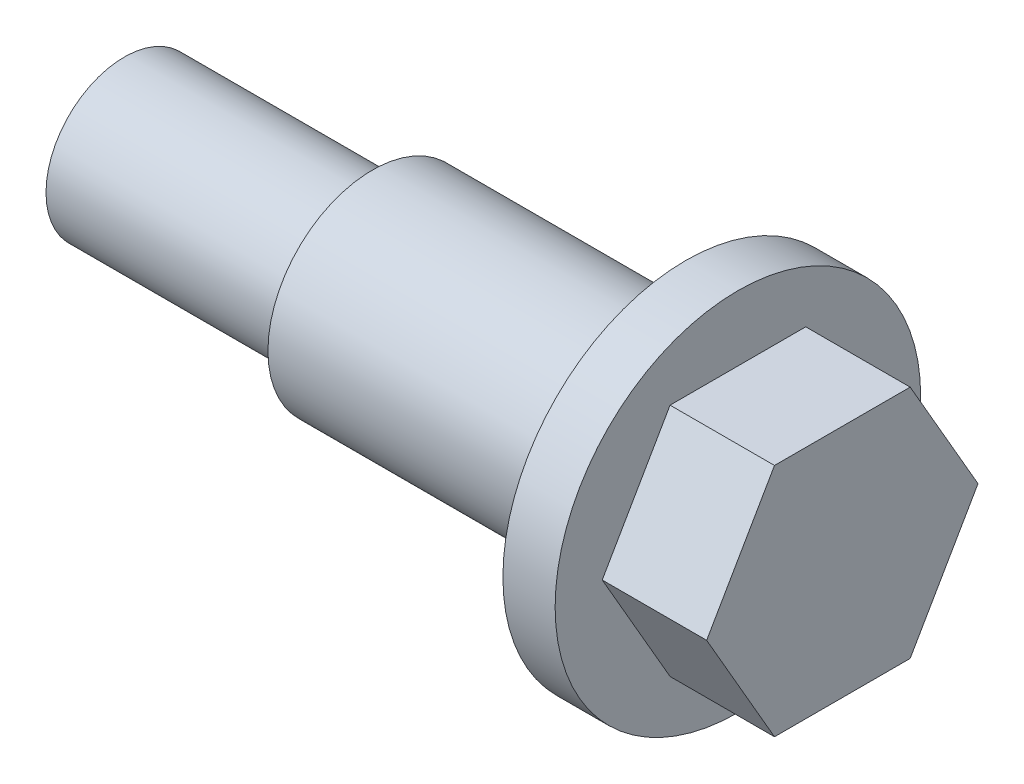
ISO-10303-21;
HEADER;
FILE_DESCRIPTION(('STEP AP214'),'2;1');
FILE_NAME('part.step','',(''),(''),'','','');
FILE_SCHEMA(('AUTOMOTIVE_DESIGN { 1 0 10303 214 1 1 1 1 }'));
ENDSEC;
DATA;
#1=APPLICATION_CONTEXT('core data for automotive mechanical design processes');
#2=APPLICATION_PROTOCOL_DEFINITION('international standard','automotive_design',2000,#1);
#3=PRODUCT_CONTEXT('',#1,'mechanical');
#4=PRODUCT('Part','Part','',(#3));
#5=PRODUCT_RELATED_PRODUCT_CATEGORY('part','',(#4));
#6=PRODUCT_DEFINITION_FORMATION('','',#4);
#7=PRODUCT_DEFINITION_CONTEXT('part definition',#1,'design');
#8=PRODUCT_DEFINITION('design','',#6,#7);
#9=PRODUCT_DEFINITION_SHAPE('','',#8);
#10=(LENGTH_UNIT() NAMED_UNIT(*) SI_UNIT(.MILLI.,.METRE.));
#11=(NAMED_UNIT(*) PLANE_ANGLE_UNIT() SI_UNIT($,.RADIAN.));
#12=(NAMED_UNIT(*) SI_UNIT($,.STERADIAN.) SOLID_ANGLE_UNIT());
#13=UNCERTAINTY_MEASURE_WITH_UNIT(LENGTH_MEASURE(1.E-05),#10,'distance_accuracy_value','');
#14=(GEOMETRIC_REPRESENTATION_CONTEXT(3) GLOBAL_UNCERTAINTY_ASSIGNED_CONTEXT((#13)) GLOBAL_UNIT_ASSIGNED_CONTEXT((#10,
#11,#12)) REPRESENTATION_CONTEXT('',''));
#15=CARTESIAN_POINT('',(0.,0.,0.));
#16=DIRECTION('',(0.,0.,1.));
#17=DIRECTION('',(1.,0.,0.));
#18=AXIS2_PLACEMENT_3D('',#15,#16,#17);
#19=CARTESIAN_POINT('',(0.,0.,0.));
#20=DIRECTION('',(1.,0.,0.));
#21=DIRECTION('',(0.,0.,-1.));
#22=AXIS2_PLACEMENT_3D('',#19,#20,#21);
#23=PLANE('',#22);
#24=CARTESIAN_POINT('',(0.,0.,0.));
#25=DIRECTION('',(-1.,0.,0.));
#26=DIRECTION('',(0.,0.,1.));
#27=AXIS2_PLACEMENT_3D('',#24,#25,#26);
#28=CIRCLE('',#27,3.);
#29=CARTESIAN_POINT('',(0.,0.,3.));
#30=VERTEX_POINT('',#29);
#31=EDGE_CURVE('E11',#30,#30,#28,.T.);
#32=ORIENTED_EDGE('',*,*,#31,.T.);
#33=EDGE_LOOP('',(#32));
#34=FACE_BOUND('',#33,.T.);
#35=ADVANCED_FACE('F43',(#34),#23,.F.);
#36=CARTESIAN_POINT('',(0.,0.,0.));
#37=DIRECTION('',(-1.,0.,0.));
#38=DIRECTION('',(0.,0.,1.));
#39=AXIS2_PLACEMENT_3D('',#36,#37,#38);
#40=CYLINDRICAL_SURFACE('',#39,3.);
#41=ORIENTED_EDGE('',*,*,#31,.F.);
#42=EDGE_LOOP('',(#41));
#43=FACE_BOUND('',#42,.T.);
#44=CARTESIAN_POINT('',(9.5,0.,0.));
#45=DIRECTION('',(-1.,0.,0.));
#46=DIRECTION('',(0.,0.,1.));
#47=AXIS2_PLACEMENT_3D('',#44,#45,#46);
#48=CIRCLE('',#47,3.);
#49=CARTESIAN_POINT('',(9.5,0.,3.));
#50=VERTEX_POINT('',#49);
#51=EDGE_CURVE('E51',#50,#50,#48,.T.);
#52=ORIENTED_EDGE('',*,*,#51,.T.);
#53=EDGE_LOOP('',(#52));
#54=FACE_BOUND('',#53,.T.);
#55=ADVANCED_FACE('F189',(#43,#54),#40,.T.);
#56=CARTESIAN_POINT('',(9.5,3.,0.));
#57=DIRECTION('',(1.,0.,0.));
#58=DIRECTION('',(0.,0.,-1.));
#59=AXIS2_PLACEMENT_3D('',#56,#57,#58);
#60=PLANE('',#59);
#61=ORIENTED_EDGE('',*,*,#51,.F.);
#62=EDGE_LOOP('',(#61));
#63=FACE_BOUND('',#62,.T.);
#64=CARTESIAN_POINT('',(9.5,0.,0.));
#65=DIRECTION('',(-1.,0.,0.));
#66=DIRECTION('',(0.,0.,1.));
#67=AXIS2_PLACEMENT_3D('',#64,#65,#66);
#68=CIRCLE('',#67,4.);
#69=CARTESIAN_POINT('',(9.5,0.,4.));
#70=VERTEX_POINT('',#69);
#71=EDGE_CURVE('E182',#70,#70,#68,.T.);
#72=ORIENTED_EDGE('',*,*,#71,.T.);
#73=EDGE_LOOP('',(#72));
#74=FACE_BOUND('',#73,.T.);
#75=ADVANCED_FACE('F191',(#63,#74),#60,.F.);
#76=CARTESIAN_POINT('',(0.,0.,0.));
#77=DIRECTION('',(-1.,0.,0.));
#78=DIRECTION('',(0.,0.,1.));
#79=AXIS2_PLACEMENT_3D('',#76,#77,#78);
#80=CYLINDRICAL_SURFACE('',#79,4.);
#81=ORIENTED_EDGE('',*,*,#71,.F.);
#82=EDGE_LOOP('',(#81));
#83=FACE_BOUND('',#82,.T.);
#84=CARTESIAN_POINT('',(21.5,0.,0.));
#85=DIRECTION('',(-1.,0.,0.));
#86=DIRECTION('',(0.,0.,1.));
#87=AXIS2_PLACEMENT_3D('',#84,#85,#86);
#88=CIRCLE('',#87,4.);
#89=CARTESIAN_POINT('',(21.5,0.,4.));
#90=VERTEX_POINT('',#89);
#91=EDGE_CURVE('E178',#90,#90,#88,.T.);
#92=ORIENTED_EDGE('',*,*,#91,.T.);
#93=EDGE_LOOP('',(#92));
#94=FACE_BOUND('',#93,.T.);
#95=ADVANCED_FACE('F194',(#83,#94),#80,.T.);
#96=CARTESIAN_POINT('',(21.5,4.,0.));
#97=DIRECTION('',(1.,0.,0.));
#98=DIRECTION('',(0.,0.,-1.));
#99=AXIS2_PLACEMENT_3D('',#96,#97,#98);
#100=PLANE('',#99);
#101=ORIENTED_EDGE('',*,*,#91,.F.);
#102=EDGE_LOOP('',(#101));
#103=FACE_BOUND('',#102,.T.);
#104=CARTESIAN_POINT('',(21.5,0.,0.));
#105=DIRECTION('',(-1.,0.,0.));
#106=DIRECTION('',(0.,0.,1.));
#107=AXIS2_PLACEMENT_3D('',#104,#105,#106);
#108=CIRCLE('',#107,7.);
#109=CARTESIAN_POINT('',(21.5,0.,7.));
#110=VERTEX_POINT('',#109);
#111=EDGE_CURVE('E174',#110,#110,#108,.T.);
#112=ORIENTED_EDGE('',*,*,#111,.T.);
#113=EDGE_LOOP('',(#112));
#114=FACE_BOUND('',#113,.T.);
#115=ADVANCED_FACE('F200',(#103,#114),#100,.F.);
#116=CARTESIAN_POINT('',(0.,0.,0.));
#117=DIRECTION('',(-1.,0.,0.));
#118=DIRECTION('',(0.,0.,1.));
#119=AXIS2_PLACEMENT_3D('',#116,#117,#118);
#120=CYLINDRICAL_SURFACE('',#119,7.);
#121=ORIENTED_EDGE('',*,*,#111,.F.);
#122=EDGE_LOOP('',(#121));
#123=FACE_BOUND('',#122,.T.);
#124=CARTESIAN_POINT('',(23.5,0.,0.));
#125=DIRECTION('',(-1.,0.,0.));
#126=DIRECTION('',(0.,0.,1.));
#127=AXIS2_PLACEMENT_3D('',#124,#125,#126);
#128=CIRCLE('',#127,7.);
#129=CARTESIAN_POINT('',(23.5,0.,7.));
#130=VERTEX_POINT('',#129);
#131=EDGE_CURVE('E170',#130,#130,#128,.T.);
#132=ORIENTED_EDGE('',*,*,#131,.T.);
#133=EDGE_LOOP('',(#132));
#134=FACE_BOUND('',#133,.T.);
#135=ADVANCED_FACE('F206',(#123,#134),#120,.T.);
#136=CARTESIAN_POINT('',(23.5,7.,0.));
#137=DIRECTION('',(-1.,0.,0.));
#138=DIRECTION('',(0.,0.,1.));
#139=AXIS2_PLACEMENT_3D('',#136,#137,#138);
#140=PLANE('',#139);
#141=ORIENTED_EDGE('',*,*,#131,.F.);
#142=EDGE_LOOP('',(#141));
#143=FACE_BOUND('',#142,.T.);
#144=DIRECTION('',(0.,0.866025403784439,-0.5));
#145=VECTOR('',#144,1.);
#146=CARTESIAN_POINT('',(23.5,-4.5,-2.59807621135331));
#147=LINE('',#146,#145);
#148=CARTESIAN_POINT('',(23.5,-4.5,-2.59807621135332));
#149=VERTEX_POINT('',#148);
#150=CARTESIAN_POINT('',(23.5,0.,-5.19615242270663));
#151=VERTEX_POINT('',#150);
#152=EDGE_CURVE('E152',#149,#151,#147,.T.);
#153=ORIENTED_EDGE('',*,*,#152,.F.);
#154=DIRECTION('',(0.,0.,-1.));
#155=VECTOR('',#154,1.);
#156=CARTESIAN_POINT('',(23.5,-4.5,2.59807621135332));
#157=LINE('',#156,#155);
#158=CARTESIAN_POINT('',(23.5,-4.5,2.59807621135332));
#159=VERTEX_POINT('',#158);
#160=EDGE_CURVE('E124',#159,#149,#157,.T.);
#161=ORIENTED_EDGE('',*,*,#160,.F.);
#162=DIRECTION('',(0.,-0.866025403784439,-0.5));
#163=VECTOR('',#162,1.);
#164=CARTESIAN_POINT('',(23.5,0.,5.19615242270663));
#165=LINE('',#164,#163);
#166=CARTESIAN_POINT('',(23.5,0.,5.19615242270663));
#167=VERTEX_POINT('',#166);
#168=EDGE_CURVE('E120',#167,#159,#165,.T.);
#169=ORIENTED_EDGE('',*,*,#168,.F.);
#170=DIRECTION('',(0.,-0.866025403784439,0.5));
#171=VECTOR('',#170,1.);
#172=CARTESIAN_POINT('',(23.5,4.5,2.59807621135332));
#173=LINE('',#172,#171);
#174=CARTESIAN_POINT('',(23.5,4.5,2.59807621135332));
#175=VERTEX_POINT('',#174);
#176=EDGE_CURVE('E96',#175,#167,#173,.T.);
#177=ORIENTED_EDGE('',*,*,#176,.F.);
#178=DIRECTION('',(0.,0.,1.));
#179=VECTOR('',#178,1.);
#180=CARTESIAN_POINT('',(23.5,4.5,-2.59807621135332));
#181=LINE('',#180,#179);
#182=CARTESIAN_POINT('',(23.5,4.5,-2.59807621135332));
#183=VERTEX_POINT('',#182);
#184=EDGE_CURVE('E88',#183,#175,#181,.T.);
#185=ORIENTED_EDGE('',*,*,#184,.F.);
#186=DIRECTION('',(0.,0.866025403784439,0.5));
#187=VECTOR('',#186,1.);
#188=CARTESIAN_POINT('',(23.5,0.,-5.19615242270663));
#189=LINE('',#188,#187);
#190=EDGE_CURVE('E58',#151,#183,#189,.T.);
#191=ORIENTED_EDGE('',*,*,#190,.F.);
#192=EDGE_LOOP('',(#153,#161,#169,#177,#185,#191));
#193=FACE_BOUND('',#192,.T.);
#194=ADVANCED_FACE('F212',(#143,#193),#140,.F.);
#195=CARTESIAN_POINT('',(9.75227291513248,4.5,2.59807621135332));
#196=DIRECTION('',(0.,0.5,0.866025403784439));
#197=DIRECTION('',(0.,-0.866025403784439,0.5));
#198=AXIS2_PLACEMENT_3D('',#195,#196,#197);
#199=PLANE('',#198);
#200=ORIENTED_EDGE('',*,*,#176,.T.);
#201=DIRECTION('',(1.,0.,0.));
#202=VECTOR('',#201,1.);
#203=CARTESIAN_POINT('',(9.75227291513248,0.,5.19615242270663));
#204=LINE('',#203,#202);
#205=CARTESIAN_POINT('',(27.5,0.,5.19615242270663));
#206=VERTEX_POINT('',#205);
#207=EDGE_CURVE('E144',#167,#206,#204,.T.);
#208=ORIENTED_EDGE('',*,*,#207,.T.);
#209=DIRECTION('',(0.,-0.866025403784439,0.5));
#210=VECTOR('',#209,1.);
#211=CARTESIAN_POINT('',(27.5,4.5,2.59807621135332));
#212=LINE('',#211,#210);
#213=CARTESIAN_POINT('',(27.5,4.5,2.59807621135332));
#214=VERTEX_POINT('',#213);
#215=EDGE_CURVE('E112',#214,#206,#212,.T.);
#216=ORIENTED_EDGE('',*,*,#215,.F.);
#217=DIRECTION('',(1.,0.,0.));
#218=VECTOR('',#217,1.);
#219=CARTESIAN_POINT('',(9.75227291513248,4.5,2.59807621135332));
#220=LINE('',#219,#218);
#221=EDGE_CURVE('E147',#175,#214,#220,.T.);
#222=ORIENTED_EDGE('',*,*,#221,.F.);
#223=EDGE_LOOP('',(#200,#208,#216,#222));
#224=FACE_BOUND('',#223,.T.);
#225=ADVANCED_FACE('F218',(#224),#199,.T.);
#226=CARTESIAN_POINT('',(9.75227291513248,0.,5.19615242270663));
#227=DIRECTION('',(0.,-0.5,0.866025403784439));
#228=DIRECTION('',(0.,-0.866025403784439,-0.5));
#229=AXIS2_PLACEMENT_3D('',#226,#227,#228);
#230=PLANE('',#229);
#231=ORIENTED_EDGE('',*,*,#168,.T.);
#232=DIRECTION('',(1.,0.,0.));
#233=VECTOR('',#232,1.);
#234=CARTESIAN_POINT('',(9.75227291513248,-4.5,2.59807621135332));
#235=LINE('',#234,#233);
#236=CARTESIAN_POINT('',(27.5,-4.5,2.59807621135332));
#237=VERTEX_POINT('',#236);
#238=EDGE_CURVE('E117',#159,#237,#235,.T.);
#239=ORIENTED_EDGE('',*,*,#238,.T.);
#240=DIRECTION('',(0.,-0.866025403784439,-0.5));
#241=VECTOR('',#240,1.);
#242=CARTESIAN_POINT('',(27.5,0.,5.19615242270663));
#243=LINE('',#242,#241);
#244=EDGE_CURVE('E105',#206,#237,#243,.T.);
#245=ORIENTED_EDGE('',*,*,#244,.F.);
#246=ORIENTED_EDGE('',*,*,#207,.F.);
#247=EDGE_LOOP('',(#231,#239,#245,#246));
#248=FACE_BOUND('',#247,.T.);
#249=ADVANCED_FACE('F118',(#248),#230,.T.);
#250=CARTESIAN_POINT('',(9.75227291513248,-4.5,2.59807621135332));
#251=DIRECTION('',(0.,-1.,0.));
#252=DIRECTION('',(0.,0.,-1.));
#253=AXIS2_PLACEMENT_3D('',#250,#251,#252);
#254=PLANE('',#253);
#255=ORIENTED_EDGE('',*,*,#160,.T.);
#256=DIRECTION('',(1.,0.,0.));
#257=VECTOR('',#256,1.);
#258=CARTESIAN_POINT('',(9.75227291513248,-4.5,-2.59807621135331));
#259=LINE('',#258,#257);
#260=CARTESIAN_POINT('',(27.5,-4.5,-2.59807621135331));
#261=VERTEX_POINT('',#260);
#262=EDGE_CURVE('E128',#149,#261,#259,.T.);
#263=ORIENTED_EDGE('',*,*,#262,.T.);
#264=DIRECTION('',(0.,0.,-1.));
#265=VECTOR('',#264,1.);
#266=CARTESIAN_POINT('',(27.5,-4.5,2.59807621135332));
#267=LINE('',#266,#265);
#268=EDGE_CURVE('E109',#237,#261,#267,.T.);
#269=ORIENTED_EDGE('',*,*,#268,.F.);
#270=ORIENTED_EDGE('',*,*,#238,.F.);
#271=EDGE_LOOP('',(#255,#263,#269,#270));
#272=FACE_BOUND('',#271,.T.);
#273=ADVANCED_FACE('F126',(#272),#254,.T.);
#274=CARTESIAN_POINT('',(9.75227291513248,-4.5,-2.59807621135331));
#275=DIRECTION('',(0.,-0.5,-0.866025403784438));
#276=DIRECTION('',(0.,0.866025403784439,-0.5));
#277=AXIS2_PLACEMENT_3D('',#274,#275,#276);
#278=PLANE('',#277);
#279=ORIENTED_EDGE('',*,*,#152,.T.);
#280=DIRECTION('',(1.,0.,0.));
#281=VECTOR('',#280,1.);
#282=CARTESIAN_POINT('',(9.75227291513248,0.,-5.19615242270663));
#283=LINE('',#282,#281);
#284=CARTESIAN_POINT('',(27.5,0.,-5.19615242270663));
#285=VERTEX_POINT('',#284);
#286=EDGE_CURVE('E151',#151,#285,#283,.T.);
#287=ORIENTED_EDGE('',*,*,#286,.T.);
#288=DIRECTION('',(0.,0.866025403784438,-0.5));
#289=VECTOR('',#288,1.);
#290=CARTESIAN_POINT('',(27.5,-4.5,-2.59807621135331));
#291=LINE('',#290,#289);
#292=EDGE_CURVE('E131',#261,#285,#291,.T.);
#293=ORIENTED_EDGE('',*,*,#292,.F.);
#294=ORIENTED_EDGE('',*,*,#262,.F.);
#295=EDGE_LOOP('',(#279,#287,#293,#294));
#296=FACE_BOUND('',#295,.T.);
#297=ADVANCED_FACE('F222',(#296),#278,.T.);
#298=CARTESIAN_POINT('',(9.75227291513248,0.,-5.19615242270663));
#299=DIRECTION('',(0.,0.5,-0.866025403784439));
#300=DIRECTION('',(0.,0.866025403784439,0.5));
#301=AXIS2_PLACEMENT_3D('',#298,#299,#300);
#302=PLANE('',#301);
#303=ORIENTED_EDGE('',*,*,#190,.T.);
#304=DIRECTION('',(1.,0.,0.));
#305=VECTOR('',#304,1.);
#306=CARTESIAN_POINT('',(9.75227291513248,4.5,-2.59807621135332));
#307=LINE('',#306,#305);
#308=CARTESIAN_POINT('',(27.5,4.5,-2.59807621135332));
#309=VERTEX_POINT('',#308);
#310=EDGE_CURVE('E148',#183,#309,#307,.T.);
#311=ORIENTED_EDGE('',*,*,#310,.T.);
#312=DIRECTION('',(0.,0.866025403784439,0.5));
#313=VECTOR('',#312,1.);
#314=CARTESIAN_POINT('',(27.5,0.,-5.19615242270663));
#315=LINE('',#314,#313);
#316=EDGE_CURVE('E134',#285,#309,#315,.T.);
#317=ORIENTED_EDGE('',*,*,#316,.F.);
#318=ORIENTED_EDGE('',*,*,#286,.F.);
#319=EDGE_LOOP('',(#303,#311,#317,#318));
#320=FACE_BOUND('',#319,.T.);
#321=ADVANCED_FACE('F224',(#320),#302,.T.);
#322=CARTESIAN_POINT('',(9.75227291513248,4.5,-2.59807621135332));
#323=DIRECTION('',(0.,1.,0.));
#324=DIRECTION('',(0.,0.,1.));
#325=AXIS2_PLACEMENT_3D('',#322,#323,#324);
#326=PLANE('',#325);
#327=ORIENTED_EDGE('',*,*,#184,.T.);
#328=ORIENTED_EDGE('',*,*,#221,.T.);
#329=DIRECTION('',(0.,0.,1.));
#330=VECTOR('',#329,1.);
#331=CARTESIAN_POINT('',(27.5,4.5,-2.59807621135332));
#332=LINE('',#331,#330);
#333=EDGE_CURVE('E67',#309,#214,#332,.T.);
#334=ORIENTED_EDGE('',*,*,#333,.F.);
#335=ORIENTED_EDGE('',*,*,#310,.F.);
#336=EDGE_LOOP('',(#327,#328,#334,#335));
#337=FACE_BOUND('',#336,.T.);
#338=ADVANCED_FACE('F226',(#337),#326,.T.);
#339=CARTESIAN_POINT('',(27.5,4.5,0.));
#340=DIRECTION('',(-1.,0.,0.));
#341=DIRECTION('',(0.,0.,1.));
#342=AXIS2_PLACEMENT_3D('',#339,#340,#341);
#343=PLANE('',#342);
#344=ORIENTED_EDGE('',*,*,#292,.T.);
#345=ORIENTED_EDGE('',*,*,#316,.T.);
#346=ORIENTED_EDGE('',*,*,#333,.T.);
#347=ORIENTED_EDGE('',*,*,#215,.T.);
#348=ORIENTED_EDGE('',*,*,#244,.T.);
#349=ORIENTED_EDGE('',*,*,#268,.T.);
#350=EDGE_LOOP('',(#344,#345,#346,#347,#348,#349));
#351=FACE_BOUND('',#350,.T.);
#352=ADVANCED_FACE('F107',(#351),#343,.F.);
#353=CLOSED_SHELL('',(#35,#55,#75,#95,#115,#135,#194,#225,#249,#273,#297,#321,#338,#352));
#354=MANIFOLD_SOLID_BREP('B2',#353);
#355=ADVANCED_BREP_SHAPE_REPRESENTATION('',(#18,#354),#14);
#356=SHAPE_DEFINITION_REPRESENTATION(#9,#355);
ENDSEC;
END-ISO-10303-21;
